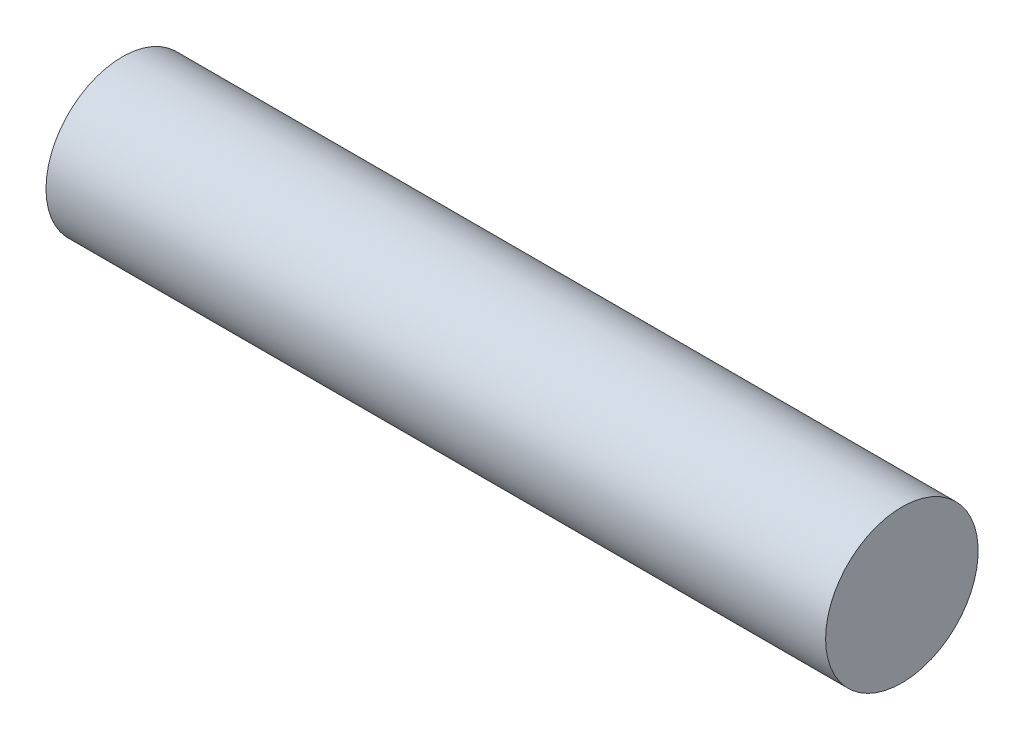
ISO-10303-21;
HEADER;
FILE_DESCRIPTION(('STEP AP214'),'2;1');
FILE_NAME('part.step','',(''),(''),'','','');
FILE_SCHEMA(('AUTOMOTIVE_DESIGN { 1 0 10303 214 1 1 1 1 }'));
ENDSEC;
DATA;
#1=APPLICATION_CONTEXT('core data for automotive mechanical design processes');
#2=APPLICATION_PROTOCOL_DEFINITION('international standard','automotive_design',2000,#1);
#3=PRODUCT_CONTEXT('',#1,'mechanical');
#4=PRODUCT('Part','Part','',(#3));
#5=PRODUCT_RELATED_PRODUCT_CATEGORY('part','',(#4));
#6=PRODUCT_DEFINITION_FORMATION('','',#4);
#7=PRODUCT_DEFINITION_CONTEXT('part definition',#1,'design');
#8=PRODUCT_DEFINITION('design','',#6,#7);
#9=PRODUCT_DEFINITION_SHAPE('','',#8);
#10=(LENGTH_UNIT() NAMED_UNIT(*) SI_UNIT(.MILLI.,.METRE.));
#11=(NAMED_UNIT(*) PLANE_ANGLE_UNIT() SI_UNIT($,.RADIAN.));
#12=(NAMED_UNIT(*) SI_UNIT($,.STERADIAN.) SOLID_ANGLE_UNIT());
#13=UNCERTAINTY_MEASURE_WITH_UNIT(LENGTH_MEASURE(1.E-05),#10,'distance_accuracy_value','');
#14=(GEOMETRIC_REPRESENTATION_CONTEXT(3) GLOBAL_UNCERTAINTY_ASSIGNED_CONTEXT((#13)) GLOBAL_UNIT_ASSIGNED_CONTEXT((#10,
#11,#12)) REPRESENTATION_CONTEXT('',''));
#15=CARTESIAN_POINT('',(0.,0.,0.));
#16=DIRECTION('',(0.,0.,1.));
#17=DIRECTION('',(1.,0.,0.));
#18=AXIS2_PLACEMENT_3D('',#15,#16,#17);
#19=CARTESIAN_POINT('',(0.,0.,0.));
#20=DIRECTION('',(1.,0.,0.));
#21=DIRECTION('',(0.,0.,-1.));
#22=AXIS2_PLACEMENT_3D('',#19,#20,#21);
#23=PLANE('',#22);
#24=CARTESIAN_POINT('',(0.,0.,0.));
#25=DIRECTION('',(-1.,0.,0.));
#26=DIRECTION('',(0.,0.,1.));
#27=AXIS2_PLACEMENT_3D('',#24,#25,#26);
#28=CIRCLE('',#27,9.);
#29=CARTESIAN_POINT('',(0.,0.,9.));
#30=VERTEX_POINT('',#29);
#31=EDGE_CURVE('E10',#30,#30,#28,.T.);
#32=ORIENTED_EDGE('',*,*,#31,.T.);
#33=EDGE_LOOP('',(#32));
#34=FACE_BOUND('',#33,.T.);
#35=ADVANCED_FACE('F43',(#34),#23,.F.);
#36=CARTESIAN_POINT('',(0.,0.,0.));
#37=DIRECTION('',(-1.,0.,0.));
#38=DIRECTION('',(0.,0.,1.));
#39=AXIS2_PLACEMENT_3D('',#36,#37,#38);
#40=CYLINDRICAL_SURFACE('',#39,9.);
#41=ORIENTED_EDGE('',*,*,#31,.F.);
#42=EDGE_LOOP('',(#41));
#43=FACE_BOUND('',#42,.T.);
#44=CARTESIAN_POINT('',(92.,0.,0.));
#45=DIRECTION('',(-1.,0.,0.));
#46=DIRECTION('',(0.,0.,1.));
#47=AXIS2_PLACEMENT_3D('',#44,#45,#46);
#48=CIRCLE('',#47,9.);
#49=CARTESIAN_POINT('',(92.,0.,9.));
#50=VERTEX_POINT('',#49);
#51=EDGE_CURVE('E50',#50,#50,#48,.T.);
#52=ORIENTED_EDGE('',*,*,#51,.T.);
#53=EDGE_LOOP('',(#52));
#54=FACE_BOUND('',#53,.T.);
#55=ADVANCED_FACE('F57',(#43,#54),#40,.T.);
#56=CARTESIAN_POINT('',(92.,9.,0.));
#57=DIRECTION('',(-1.,0.,0.));
#58=DIRECTION('',(0.,0.,1.));
#59=AXIS2_PLACEMENT_3D('',#56,#57,#58);
#60=PLANE('',#59);
#61=ORIENTED_EDGE('',*,*,#51,.F.);
#62=EDGE_LOOP('',(#61));
#63=FACE_BOUND('',#62,.T.);
#64=ADVANCED_FACE('F59',(#63),#60,.F.);
#65=CLOSED_SHELL('',(#35,#55,#64));
#66=MANIFOLD_SOLID_BREP('B2',#65);
#67=ADVANCED_BREP_SHAPE_REPRESENTATION('',(#18,#66),#14);
#68=SHAPE_DEFINITION_REPRESENTATION(#9,#67);
ENDSEC;
END-ISO-10303-21;
